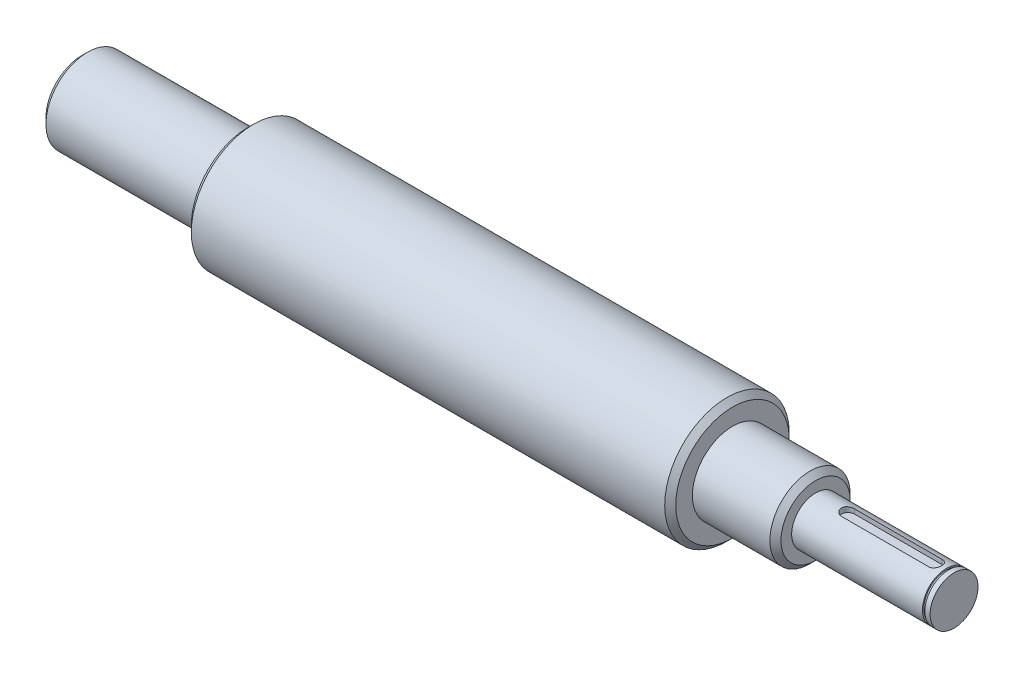
ISO-10303-21;
HEADER;
FILE_DESCRIPTION(('STEP AP214'),'2;1');
FILE_NAME('part.step','',(''),(''),'','','');
FILE_SCHEMA(('AUTOMOTIVE_DESIGN { 1 0 10303 214 1 1 1 1 }'));
ENDSEC;
DATA;
#1=APPLICATION_CONTEXT('core data for automotive mechanical design processes');
#2=APPLICATION_PROTOCOL_DEFINITION('international standard','automotive_design',2000,#1);
#3=PRODUCT_CONTEXT('',#1,'mechanical');
#4=PRODUCT('Part','Part','',(#3));
#5=PRODUCT_RELATED_PRODUCT_CATEGORY('part','',(#4));
#6=PRODUCT_DEFINITION_FORMATION('','',#4);
#7=PRODUCT_DEFINITION_CONTEXT('part definition',#1,'design');
#8=PRODUCT_DEFINITION('design','',#6,#7);
#9=PRODUCT_DEFINITION_SHAPE('','',#8);
#10=(LENGTH_UNIT() NAMED_UNIT(*) SI_UNIT(.MILLI.,.METRE.));
#11=(NAMED_UNIT(*) PLANE_ANGLE_UNIT() SI_UNIT($,.RADIAN.));
#12=(NAMED_UNIT(*) SI_UNIT($,.STERADIAN.) SOLID_ANGLE_UNIT());
#13=UNCERTAINTY_MEASURE_WITH_UNIT(LENGTH_MEASURE(1.E-05),#10,'distance_accuracy_value','');
#14=(GEOMETRIC_REPRESENTATION_CONTEXT(3) GLOBAL_UNCERTAINTY_ASSIGNED_CONTEXT((#13)) GLOBAL_UNIT_ASSIGNED_CONTEXT((#10,
#11,#12)) REPRESENTATION_CONTEXT('',''));
#15=CARTESIAN_POINT('',(0.,0.,0.));
#16=DIRECTION('',(0.,0.,1.));
#17=DIRECTION('',(1.,0.,0.));
#18=AXIS2_PLACEMENT_3D('',#15,#16,#17);
#19=CARTESIAN_POINT('',(-1910.96110575399,0.,0.));
#20=DIRECTION('',(-1.,0.,0.));
#21=DIRECTION('',(0.,0.,1.));
#22=AXIS2_PLACEMENT_3D('',#19,#20,#21);
#23=CYLINDRICAL_SURFACE('',#22,11.);
#24=CARTESIAN_POINT('',(136.5,0.,0.));
#25=DIRECTION('',(-1.,0.,0.));
#26=DIRECTION('',(0.,0.,1.));
#27=AXIS2_PLACEMENT_3D('',#24,#25,#26);
#28=CIRCLE('',#27,11.);
#29=CARTESIAN_POINT('',(136.5,0.,11.));
#30=VERTEX_POINT('',#29);
#31=EDGE_CURVE('E128',#30,#30,#28,.T.);
#32=ORIENTED_EDGE('',*,*,#31,.F.);
#33=EDGE_LOOP('',(#32));
#34=FACE_BOUND('',#33,.T.);
#35=DIRECTION('',(-1.,0.,0.));
#36=VECTOR('',#35,1.);
#37=CARTESIAN_POINT('',(-1910.96110575399,10.5830052442584,-3.));
#38=LINE('',#37,#36);
#39=CARTESIAN_POINT('',(151.375000000001,10.5830052442584,-3.));
#40=VERTEX_POINT('',#39);
#41=CARTESIAN_POINT('',(191.375000000001,10.5830052442584,-3.));
#42=VERTEX_POINT('',#41);
#43=EDGE_CURVE('E12',#40,#42,#38,.F.);
#44=ORIENTED_EDGE('',*,*,#43,.T.);
#45=CARTESIAN_POINT('',(191.375000000001,10.5830052442584,-3.));
#46=CARTESIAN_POINT('',(191.457693891411,10.5829949970026,-3.00000989976809));
#47=CARTESIAN_POINT('',(191.540381704593,10.5839742471726,-2.99658102723594));
#48=CARTESIAN_POINT('',(191.70513356623,10.5878356752194,-2.98292268314841));
#49=CARTESIAN_POINT('',(191.78719773163,10.5907174869552,-2.97269452008914));
#50=CARTESIAN_POINT('',(191.949942512146,10.598299618142,-2.9455445902732));
#51=CARTESIAN_POINT('',(192.030625789387,10.6029958951229,-2.92863770126909));
#52=CARTESIAN_POINT('',(192.190203254055,10.6140571066224,-2.88829120712689));
#53=CARTESIAN_POINT('',(192.269097407409,10.6204220728906,-2.86485147768949));
#54=CARTESIAN_POINT('',(192.502242907165,10.6417494872311,-2.78500332821793));
#55=CARTESIAN_POINT('',(192.653139394856,10.6589535681767,-2.71903526586306));
#56=CARTESIAN_POINT('',(192.941705341769,10.6973836998985,-2.56365897700124));
#57=CARTESIAN_POINT('',(193.079370097105,10.7186111730806,-2.4742424563657));
#58=CARTESIAN_POINT('',(193.341209705979,10.7633148792344,-2.27200424315805));
#59=CARTESIAN_POINT('',(193.464991878244,10.7868322128172,-2.15868225262836));
#60=CARTESIAN_POINT('',(193.692051438906,10.8331129950831,-1.91292298422354));
#61=CARTESIAN_POINT('',(193.795325477294,10.8558763200935,-1.78048258944452));
#62=CARTESIAN_POINT('',(193.980098906747,10.8985459264206,-1.49749198480951));
#63=CARTESIAN_POINT('',(194.061203079822,10.9183977479742,-1.34667477161623));
#64=CARTESIAN_POINT('',(194.19674841378,10.9525311229674,-1.03291980522386));
#65=CARTESIAN_POINT('',(194.251195521133,10.9668139185607,-0.869984764533398));
#66=CARTESIAN_POINT('',(194.330601734903,10.9879090070619,-0.54074467589672));
#67=CARTESIAN_POINT('',(194.35623432637,10.9948916417093,-0.374613167612536));
#68=CARTESIAN_POINT('',(194.379404664848,11.0011960589752,-0.0402673813620229));
#69=CARTESIAN_POINT('',(194.376946716179,11.0005190152883,0.127946573564692));
#70=CARTESIAN_POINT('',(194.344475124185,10.9917041066205,0.456980924404252));
#71=CARTESIAN_POINT('',(194.315189973227,10.9837634920705,0.617879308918083));
#72=CARTESIAN_POINT('',(194.231074784142,10.9615477415639,0.932383527853141));
#73=CARTESIAN_POINT('',(194.176243508316,10.9472722986892,1.08598900853898));
#74=CARTESIAN_POINT('',(194.042045133194,10.9137016176963,1.38338788045077));
#75=CARTESIAN_POINT('',(193.962431753762,10.8943563157114,1.52706425574145));
#76=CARTESIAN_POINT('',(193.781120130094,10.8527253375081,1.79926098198643));
#77=CARTESIAN_POINT('',(193.679417827189,10.830439121215,1.92777854091954));
#78=CARTESIAN_POINT('',(193.452976764917,10.7844948742978,2.1703484411203));
#79=CARTESIAN_POINT('',(193.327605446132,10.760815765188,2.28380693028892));
#80=CARTESIAN_POINT('',(193.059337619131,10.7153886222241,2.48826234185508));
#81=CARTESIAN_POINT('',(192.916436247547,10.6936411271563,2.57925300980783));
#82=CARTESIAN_POINT('',(192.615805187247,10.6544469945807,2.73667910615422));
#83=CARTESIAN_POINT('',(192.457975757244,10.6370325899538,2.80293223890786));
#84=CARTESIAN_POINT('',(192.132912905474,10.6088816209578,2.9076832432578));
#85=CARTESIAN_POINT('',(191.965694057726,10.598135003286,2.94622291362359));
#86=CARTESIAN_POINT('',(191.726645560134,10.588613232355,2.98015870664207));
#87=CARTESIAN_POINT('',(191.656483540277,10.5865140551644,2.98759962141261));
#88=CARTESIAN_POINT('',(191.51589244676,10.58371035186,2.99751512863222));
#89=CARTESIAN_POINT('',(191.445463964942,10.5830036423878,2.99999749605757));
#90=CARTESIAN_POINT('',(191.375000000001,10.5830052442584,3.));
#91=B_SPLINE_CURVE_WITH_KNOTS('',3,(#45,#46,#47,#48,#49,#50,#51,#52,#53,#54,#55,#56,#57,#58,#59,
#60,#61,#62,#63,#64,#65,#66,#67,#68,#69,#70,#71,#72,#73,#74,#75,#76,#77,#78,#79,#80,#81,#82,#83,
#84,#85,#86,#87,#88,#89,#90),.UNSPECIFIED.,.F.,.F.,(4,2,2,2,2,2,2,2,2,2,2,2,2,2,2,2,2,2,2,2,2,2,
4),(0.,0.247994395628699,0.495941079544158,0.743338515979092,0.99074065992621,1.48499724217186,
1.97942888795734,2.4854708385663,2.99159538337129,3.50622794981869,4.02074566333959,
4.52296979924473,5.02511698025349,5.51402000992994,6.00294672920888,6.49689640600088,
6.99093691914145,7.50077286033224,8.01075056671348,8.5244155087371,9.0373040824346,
9.24891043373585,9.46018472611219),.UNSPECIFIED.);
#92=CARTESIAN_POINT('',(191.375000000001,10.5830052442584,3.));
#93=VERTEX_POINT('',#92);
#94=EDGE_CURVE('E176',#42,#93,#91,.T.);
#95=ORIENTED_EDGE('',*,*,#94,.T.);
#96=DIRECTION('',(-1.,0.,0.));
#97=VECTOR('',#96,1.);
#98=CARTESIAN_POINT('',(-1910.96110575399,10.5830052442584,3.));
#99=LINE('',#98,#97);
#100=CARTESIAN_POINT('',(151.375000000001,10.5830052442584,3.));
#101=VERTEX_POINT('',#100);
#102=EDGE_CURVE('E49',#93,#101,#99,.T.);
#103=ORIENTED_EDGE('',*,*,#102,.T.);
#104=CARTESIAN_POINT('',(151.375000000001,10.5830052442584,3.));
#105=CARTESIAN_POINT('',(151.292306108591,10.5829949970026,3.00000989976809));
#106=CARTESIAN_POINT('',(151.209618295409,10.5839742471726,2.99658102723594));
#107=CARTESIAN_POINT('',(151.044866433772,10.5878356752194,2.98292268314841));
#108=CARTESIAN_POINT('',(150.962802268372,10.5907174869552,2.97269452008914));
#109=CARTESIAN_POINT('',(150.800057487856,10.598299618142,2.94554459027321));
#110=CARTESIAN_POINT('',(150.719374210614,10.6029958951229,2.9286377012691));
#111=CARTESIAN_POINT('',(150.559796745946,10.6140571066224,2.88829120712689));
#112=CARTESIAN_POINT('',(150.480902592592,10.6204220728906,2.8648514776895));
#113=CARTESIAN_POINT('',(150.247757092837,10.6417494872311,2.78500332821793));
#114=CARTESIAN_POINT('',(150.096860605145,10.6589535681767,2.71903526586306));
#115=CARTESIAN_POINT('',(149.808294658232,10.6973836998985,2.56365897700124));
#116=CARTESIAN_POINT('',(149.670629902897,10.7186111730806,2.4742424563657));
#117=CARTESIAN_POINT('',(149.408790294022,10.7633148792344,2.27200424315805));
#118=CARTESIAN_POINT('',(149.285008121757,10.7868322128172,2.15868225262836));
#119=CARTESIAN_POINT('',(149.057948561095,10.8331129950831,1.91292298422354));
#120=CARTESIAN_POINT('',(148.954674522707,10.8558763200935,1.78048258944452));
#121=CARTESIAN_POINT('',(148.769901093254,10.8985459264206,1.49749198480951));
#122=CARTESIAN_POINT('',(148.68879692018,10.9183977479742,1.34667477161622));
#123=CARTESIAN_POINT('',(148.553251586221,10.9525311229674,1.03291980522385));
#124=CARTESIAN_POINT('',(148.498804478869,10.9668139185607,0.869984764533394));
#125=CARTESIAN_POINT('',(148.419398265098,10.9879090070619,0.540744675896721));
#126=CARTESIAN_POINT('',(148.393765673631,10.9948916417093,0.374613167612538));
#127=CARTESIAN_POINT('',(148.370595335154,11.0011960589752,0.0402673813620239));
#128=CARTESIAN_POINT('',(148.373053283822,11.0005190152883,-0.127946573564691));
#129=CARTESIAN_POINT('',(148.405524875816,10.9917041066205,-0.456980924404252));
#130=CARTESIAN_POINT('',(148.434810026774,10.9837634920705,-0.617879308918083));
#131=CARTESIAN_POINT('',(148.518925215859,10.9615477415639,-0.932383527853141));
#132=CARTESIAN_POINT('',(148.573756491685,10.9472722986892,-1.08598900853898));
#133=CARTESIAN_POINT('',(148.707954866808,10.9137016176963,-1.38338788045077));
#134=CARTESIAN_POINT('',(148.787568246239,10.8943563157114,-1.52706425574145));
#135=CARTESIAN_POINT('',(148.968879869907,10.8527253375081,-1.79926098198643));
#136=CARTESIAN_POINT('',(149.070582172813,10.830439121215,-1.92777854091954));
#137=CARTESIAN_POINT('',(149.297023235085,10.7844948742978,-2.17034844112029));
#138=CARTESIAN_POINT('',(149.42239455387,10.760815765188,-2.28380693028891));
#139=CARTESIAN_POINT('',(149.690662380871,10.7153886222241,-2.48826234185507));
#140=CARTESIAN_POINT('',(149.833563752455,10.6936411271564,-2.57925300980783));
#141=CARTESIAN_POINT('',(150.134194812755,10.6544469945807,-2.73667910615423));
#142=CARTESIAN_POINT('',(150.292024242758,10.6370325899538,-2.80293223890787));
#143=CARTESIAN_POINT('',(150.617087094528,10.6088816209578,-2.90768324325781));
#144=CARTESIAN_POINT('',(150.784305942276,10.598135003286,-2.9462229136236));
#145=CARTESIAN_POINT('',(151.023354439867,10.588613232355,-2.98015870664207));
#146=CARTESIAN_POINT('',(151.093516459724,10.5865140551644,-2.98759962141261));
#147=CARTESIAN_POINT('',(151.234107553241,10.58371035186,-2.99751512863222));
#148=CARTESIAN_POINT('',(151.304536035059,10.5830036423878,-2.99999749605757));
#149=CARTESIAN_POINT('',(151.375000000001,10.5830052442584,-3.));
#150=B_SPLINE_CURVE_WITH_KNOTS('',3,(#104,#105,#106,#107,#108,#109,#110,#111,#112,#113,#114,
#115,#116,#117,#118,#119,#120,#121,#122,#123,#124,#125,#126,#127,#128,#129,#130,#131,#132,#133,
#134,#135,#136,#137,#138,#139,#140,#141,#142,#143,#144,#145,#146,#147,#148,#149),.UNSPECIFIED.,
.F.,.F.,(4,2,2,2,2,2,2,2,2,2,2,2,2,2,2,2,2,2,2,2,2,2,4),(0.,0.247994395628672,0.49594107954413,
0.743338515979064,0.99074065992621,1.48499724217186,1.97942888795734,2.4854708385663,
2.99159538337129,3.5062279498187,4.02074566333959,4.52296979924472,5.02511698025349,
5.51402000992994,6.00294672920887,6.49689640600088,6.99093691914145,7.50077286033221,
8.01075056671348,8.52441550873715,9.0373040824346,9.24891043373582,9.46018472611219),.UNSPECIFIED.);
#151=EDGE_CURVE('E56',#101,#40,#150,.T.);
#152=ORIENTED_EDGE('',*,*,#151,.T.);
#153=EDGE_LOOP('',(#44,#95,#103,#152));
#154=FACE_BOUND('',#153,.T.);
#155=CARTESIAN_POINT('',(196.49768,0.,0.));
#156=DIRECTION('',(1.,0.,0.));
#157=DIRECTION('',(0.,0.,-1.));
#158=AXIS2_PLACEMENT_3D('',#155,#156,#157);
#159=CIRCLE('',#158,11.);
#160=CARTESIAN_POINT('',(196.49768,0.,-11.));
#161=VERTEX_POINT('',#160);
#162=EDGE_CURVE('E108',#161,#161,#159,.T.);
#163=ORIENTED_EDGE('',*,*,#162,.F.);
#164=EDGE_LOOP('',(#163));
#165=FACE_BOUND('',#164,.T.);
#166=ADVANCED_FACE('F40',(#34,#154,#165),#23,.T.);
#167=CARTESIAN_POINT('',(-200.,0.,0.));
#168=DIRECTION('',(1.,0.,0.));
#169=DIRECTION('',(0.,0.,-1.));
#170=AXIS2_PLACEMENT_3D('',#167,#168,#169);
#171=PLANE('',#170);
#172=CARTESIAN_POINT('',(-200.,0.,0.));
#173=DIRECTION('',(1.,0.,0.));
#174=DIRECTION('',(0.,0.,-1.));
#175=AXIS2_PLACEMENT_3D('',#172,#173,#174);
#176=CIRCLE('',#175,16.51);
#177=CARTESIAN_POINT('',(-200.,0.,-16.51));
#178=VERTEX_POINT('',#177);
#179=EDGE_CURVE('E160',#178,#178,#176,.F.);
#180=ORIENTED_EDGE('',*,*,#179,.T.);
#181=EDGE_LOOP('',(#180));
#182=FACE_BOUND('',#181,.T.);
#183=ADVANCED_FACE('F220',(#182),#171,.F.);
#184=CARTESIAN_POINT('',(-1910.96110575399,0.,0.));
#185=DIRECTION('',(-1.,0.,0.));
#186=DIRECTION('',(0.,0.,1.));
#187=AXIS2_PLACEMENT_3D('',#184,#185,#186);
#188=CYLINDRICAL_SURFACE('',#187,19.05);
#189=CARTESIAN_POINT('',(-126.34,0.,0.));
#190=DIRECTION('',(1.,0.,0.));
#191=DIRECTION('',(0.,0.,-1.));
#192=AXIS2_PLACEMENT_3D('',#189,#190,#191);
#193=CIRCLE('',#192,19.05);
#194=CARTESIAN_POINT('',(-126.34,0.,-19.05));
#195=VERTEX_POINT('',#194);
#196=EDGE_CURVE('E168',#195,#195,#193,.F.);
#197=ORIENTED_EDGE('',*,*,#196,.T.);
#198=EDGE_LOOP('',(#197));
#199=FACE_BOUND('',#198,.T.);
#200=CARTESIAN_POINT('',(-197.46,0.,0.));
#201=DIRECTION('',(1.,0.,0.));
#202=DIRECTION('',(0.,0.,-1.));
#203=AXIS2_PLACEMENT_3D('',#200,#201,#202);
#204=CIRCLE('',#203,19.05);
#205=CARTESIAN_POINT('',(-197.46,0.,-19.05));
#206=VERTEX_POINT('',#205);
#207=EDGE_CURVE('E164',#206,#206,#204,.T.);
#208=ORIENTED_EDGE('',*,*,#207,.T.);
#209=EDGE_LOOP('',(#208));
#210=FACE_BOUND('',#209,.T.);
#211=ADVANCED_FACE('F225',(#199,#210),#188,.T.);
#212=CARTESIAN_POINT('',(-123.8,19.05,0.));
#213=DIRECTION('',(1.,0.,0.));
#214=DIRECTION('',(0.,0.,-1.));
#215=AXIS2_PLACEMENT_3D('',#212,#213,#214);
#216=PLANE('',#215);
#217=CARTESIAN_POINT('',(-123.8,0.,0.));
#218=DIRECTION('',(1.,0.,0.));
#219=DIRECTION('',(0.,0.,-1.));
#220=AXIS2_PLACEMENT_3D('',#217,#218,#219);
#221=CIRCLE('',#220,21.59);
#222=CARTESIAN_POINT('',(-123.8,0.,-21.59));
#223=VERTEX_POINT('',#222);
#224=EDGE_CURVE('E172',#223,#223,#221,.T.);
#225=ORIENTED_EDGE('',*,*,#224,.T.);
#226=EDGE_LOOP('',(#225));
#227=FACE_BOUND('',#226,.T.);
#228=CARTESIAN_POINT('',(-123.8,0.,0.));
#229=DIRECTION('',(1.,0.,0.));
#230=DIRECTION('',(0.,0.,-1.));
#231=AXIS2_PLACEMENT_3D('',#228,#229,#230);
#232=CIRCLE('',#231,26.0349999999998);
#233=CARTESIAN_POINT('',(-123.8,0.,-26.0349999999998));
#234=VERTEX_POINT('',#233);
#235=EDGE_CURVE('E152',#234,#234,#232,.F.);
#236=ORIENTED_EDGE('',*,*,#235,.T.);
#237=EDGE_LOOP('',(#236));
#238=FACE_BOUND('',#237,.T.);
#239=ADVANCED_FACE('F398',(#227,#238),#216,.F.);
#240=CARTESIAN_POINT('',(-1910.96110575399,0.,0.));
#241=DIRECTION('',(-1.,0.,0.));
#242=DIRECTION('',(0.,0.,1.));
#243=AXIS2_PLACEMENT_3D('',#240,#241,#242);
#244=CYLINDRICAL_SURFACE('',#243,28.575);
#245=CARTESIAN_POINT('',(-121.26,0.,0.));
#246=DIRECTION('',(1.,0.,0.));
#247=DIRECTION('',(0.,0.,-1.));
#248=AXIS2_PLACEMENT_3D('',#245,#246,#247);
#249=CIRCLE('',#248,28.575);
#250=CARTESIAN_POINT('',(-121.26,0.,-28.575));
#251=VERTEX_POINT('',#250);
#252=EDGE_CURVE('E156',#251,#251,#249,.T.);
#253=ORIENTED_EDGE('',*,*,#252,.T.);
#254=EDGE_LOOP('',(#253));
#255=FACE_BOUND('',#254,.T.);
#256=CARTESIAN_POINT('',(95.8599999999998,0.,0.));
#257=DIRECTION('',(-1.,0.,0.));
#258=DIRECTION('',(0.,0.,1.));
#259=AXIS2_PLACEMENT_3D('',#256,#257,#258);
#260=CIRCLE('',#259,28.575);
#261=CARTESIAN_POINT('',(95.8599999999998,0.,28.575));
#262=VERTEX_POINT('',#261);
#263=EDGE_CURVE('E144',#262,#262,#260,.T.);
#264=ORIENTED_EDGE('',*,*,#263,.T.);
#265=EDGE_LOOP('',(#264));
#266=FACE_BOUND('',#265,.T.);
#267=ADVANCED_FACE('F391',(#255,#266),#244,.T.);
#268=CARTESIAN_POINT('',(98.4,28.575,0.));
#269=DIRECTION('',(-1.,0.,0.));
#270=DIRECTION('',(0.,0.,1.));
#271=AXIS2_PLACEMENT_3D('',#268,#269,#270);
#272=PLANE('',#271);
#273=CARTESIAN_POINT('',(98.4,0.,0.));
#274=DIRECTION('',(-1.,0.,0.));
#275=DIRECTION('',(0.,0.,1.));
#276=AXIS2_PLACEMENT_3D('',#273,#274,#275);
#277=CIRCLE('',#276,26.035);
#278=CARTESIAN_POINT('',(98.4,0.,26.035));
#279=VERTEX_POINT('',#278);
#280=EDGE_CURVE('E148',#279,#279,#277,.F.);
#281=ORIENTED_EDGE('',*,*,#280,.T.);
#282=EDGE_LOOP('',(#281));
#283=FACE_BOUND('',#282,.T.);
#284=CARTESIAN_POINT('',(98.4,0.,0.));
#285=DIRECTION('',(-1.,0.,0.));
#286=DIRECTION('',(0.,0.,1.));
#287=AXIS2_PLACEMENT_3D('',#284,#285,#286);
#288=CIRCLE('',#287,18.415);
#289=CARTESIAN_POINT('',(98.4,0.,18.415));
#290=VERTEX_POINT('',#289);
#291=EDGE_CURVE('E132',#290,#290,#288,.T.);
#292=ORIENTED_EDGE('',*,*,#291,.T.);
#293=EDGE_LOOP('',(#292));
#294=FACE_BOUND('',#293,.T.);
#295=ADVANCED_FACE('F385',(#283,#294),#272,.F.);
#296=CARTESIAN_POINT('',(-1910.96110575399,0.,0.));
#297=DIRECTION('',(-1.,0.,0.));
#298=DIRECTION('',(0.,0.,1.));
#299=AXIS2_PLACEMENT_3D('',#296,#297,#298);
#300=CYLINDRICAL_SURFACE('',#299,18.415);
#301=CARTESIAN_POINT('',(133.96,0.,0.));
#302=DIRECTION('',(-1.,0.,0.));
#303=DIRECTION('',(0.,0.,1.));
#304=AXIS2_PLACEMENT_3D('',#301,#302,#303);
#305=CIRCLE('',#304,18.415);
#306=CARTESIAN_POINT('',(133.96,0.,18.415));
#307=VERTEX_POINT('',#306);
#308=EDGE_CURVE('E136',#307,#307,#305,.T.);
#309=ORIENTED_EDGE('',*,*,#308,.T.);
#310=EDGE_LOOP('',(#309));
#311=FACE_BOUND('',#310,.T.);
#312=ORIENTED_EDGE('',*,*,#291,.F.);
#313=EDGE_LOOP('',(#312));
#314=FACE_BOUND('',#313,.T.);
#315=ADVANCED_FACE('F379',(#311,#314),#300,.T.);
#316=CARTESIAN_POINT('',(136.5,18.415,0.));
#317=DIRECTION('',(-1.,0.,0.));
#318=DIRECTION('',(0.,0.,1.));
#319=AXIS2_PLACEMENT_3D('',#316,#317,#318);
#320=PLANE('',#319);
#321=CARTESIAN_POINT('',(136.5,0.,0.));
#322=DIRECTION('',(-1.,0.,0.));
#323=DIRECTION('',(0.,0.,1.));
#324=AXIS2_PLACEMENT_3D('',#321,#322,#323);
#325=CIRCLE('',#324,15.8750000000001);
#326=CARTESIAN_POINT('',(136.5,0.,15.8750000000001));
#327=VERTEX_POINT('',#326);
#328=EDGE_CURVE('E140',#327,#327,#325,.F.);
#329=ORIENTED_EDGE('',*,*,#328,.T.);
#330=EDGE_LOOP('',(#329));
#331=FACE_BOUND('',#330,.T.);
#332=ORIENTED_EDGE('',*,*,#31,.T.);
#333=EDGE_LOOP('',(#332));
#334=FACE_BOUND('',#333,.T.);
#335=ADVANCED_FACE('F289',(#331,#334),#320,.F.);
#336=CARTESIAN_POINT('',(133.96,0.,0.));
#337=DIRECTION('',(-1.,0.,0.));
#338=DIRECTION('',(0.,0.,1.));
#339=AXIS2_PLACEMENT_3D('',#336,#337,#338);
#340=CONICAL_SURFACE('',#339,18.415,0.78539816339739);
#341=ORIENTED_EDGE('',*,*,#328,.F.);
#342=EDGE_LOOP('',(#341));
#343=FACE_BOUND('',#342,.T.);
#344=ORIENTED_EDGE('',*,*,#308,.F.);
#345=EDGE_LOOP('',(#344));
#346=FACE_BOUND('',#345,.T.);
#347=ADVANCED_FACE('F299',(#343,#346),#340,.T.);
#348=CARTESIAN_POINT('',(95.8599999999998,0.,0.));
#349=DIRECTION('',(-1.,0.,0.));
#350=DIRECTION('',(0.,0.,1.));
#351=AXIS2_PLACEMENT_3D('',#348,#349,#350);
#352=CONICAL_SURFACE('',#351,28.575,0.785398163397412);
#353=ORIENTED_EDGE('',*,*,#280,.F.);
#354=EDGE_LOOP('',(#353));
#355=FACE_BOUND('',#354,.T.);
#356=ORIENTED_EDGE('',*,*,#263,.F.);
#357=EDGE_LOOP('',(#356));
#358=FACE_BOUND('',#357,.T.);
#359=ADVANCED_FACE('F305',(#355,#358),#352,.T.);
#360=CARTESIAN_POINT('',(-123.8,0.,0.));
#361=DIRECTION('',(1.,0.,0.));
#362=DIRECTION('',(0.,0.,-1.));
#363=AXIS2_PLACEMENT_3D('',#360,#361,#362);
#364=CONICAL_SURFACE('',#363,26.0349999999999,0.785398163397467);
#365=ORIENTED_EDGE('',*,*,#252,.F.);
#366=EDGE_LOOP('',(#365));
#367=FACE_BOUND('',#366,.T.);
#368=ORIENTED_EDGE('',*,*,#235,.F.);
#369=EDGE_LOOP('',(#368));
#370=FACE_BOUND('',#369,.T.);
#371=ADVANCED_FACE('F314',(#367,#370),#364,.T.);
#372=CARTESIAN_POINT('',(-200.,0.,0.));
#373=DIRECTION('',(1.,0.,0.));
#374=DIRECTION('',(0.,0.,-1.));
#375=AXIS2_PLACEMENT_3D('',#372,#373,#374);
#376=CONICAL_SURFACE('',#375,16.51,0.785398163397446);
#377=ORIENTED_EDGE('',*,*,#207,.F.);
#378=EDGE_LOOP('',(#377));
#379=FACE_BOUND('',#378,.T.);
#380=ORIENTED_EDGE('',*,*,#179,.F.);
#381=EDGE_LOOP('',(#380));
#382=FACE_BOUND('',#381,.T.);
#383=ADVANCED_FACE('F324',(#379,#382),#376,.T.);
#384=CARTESIAN_POINT('',(-126.34,0.,0.));
#385=DIRECTION('',(1.,0.,0.));
#386=DIRECTION('',(0.,0.,-1.));
#387=AXIS2_PLACEMENT_3D('',#384,#385,#386);
#388=TOROIDAL_SURFACE('',#387,21.59,2.54);
#389=ORIENTED_EDGE('',*,*,#224,.F.);
#390=EDGE_LOOP('',(#389));
#391=FACE_BOUND('',#390,.T.);
#392=ORIENTED_EDGE('',*,*,#196,.F.);
#393=EDGE_LOOP('',(#392));
#394=FACE_BOUND('',#393,.T.);
#395=ADVANCED_FACE('F42',(#391,#394),#388,.F.);
#396=CARTESIAN_POINT('',(151.375000000001,8.5,0.));
#397=DIRECTION('',(0.,1.,0.));
#398=DIRECTION('',(0.,0.,1.));
#399=AXIS2_PLACEMENT_3D('',#396,#397,#398);
#400=CYLINDRICAL_SURFACE('',#399,3.);
#401=DIRECTION('',(0.,1.,0.));
#402=VECTOR('',#401,1.);
#403=CARTESIAN_POINT('',(151.375000000001,8.5,3.));
#404=LINE('',#403,#402);
#405=CARTESIAN_POINT('',(151.375000000001,8.5,3.));
#406=VERTEX_POINT('',#405);
#407=EDGE_CURVE('E79',#406,#101,#404,.T.);
#408=ORIENTED_EDGE('',*,*,#407,.F.);
#409=CARTESIAN_POINT('',(151.375000000001,8.5,0.));
#410=DIRECTION('',(0.,1.,0.));
#411=DIRECTION('',(0.,0.,1.));
#412=AXIS2_PLACEMENT_3D('',#409,#410,#411);
#413=CIRCLE('',#412,3.);
#414=CARTESIAN_POINT('',(151.375000000001,8.5,-3.));
#415=VERTEX_POINT('',#414);
#416=EDGE_CURVE('E83',#415,#406,#413,.T.);
#417=ORIENTED_EDGE('',*,*,#416,.F.);
#418=DIRECTION('',(0.,1.,0.));
#419=VECTOR('',#418,1.);
#420=CARTESIAN_POINT('',(151.375000000001,8.5,-3.));
#421=LINE('',#420,#419);
#422=EDGE_CURVE('E116',#415,#40,#421,.T.);
#423=ORIENTED_EDGE('',*,*,#422,.T.);
#424=ORIENTED_EDGE('',*,*,#151,.F.);
#425=EDGE_LOOP('',(#408,#417,#423,#424));
#426=FACE_BOUND('',#425,.T.);
#427=ADVANCED_FACE('F81',(#426),#400,.F.);
#428=CARTESIAN_POINT('',(151.375000000001,8.5,-3.));
#429=DIRECTION('',(0.,0.,-1.));
#430=DIRECTION('',(-1.,0.,0.));
#431=AXIS2_PLACEMENT_3D('',#428,#429,#430);
#432=PLANE('',#431);
#433=ORIENTED_EDGE('',*,*,#422,.F.);
#434=DIRECTION('',(-1.,0.,0.));
#435=VECTOR('',#434,1.);
#436=CARTESIAN_POINT('',(151.375000000001,8.5,-3.));
#437=LINE('',#436,#435);
#438=CARTESIAN_POINT('',(191.375000000001,8.5,-3.));
#439=VERTEX_POINT('',#438);
#440=EDGE_CURVE('E89',#439,#415,#437,.T.);
#441=ORIENTED_EDGE('',*,*,#440,.F.);
#442=DIRECTION('',(0.,1.,0.));
#443=VECTOR('',#442,1.);
#444=CARTESIAN_POINT('',(191.375000000001,8.5,-3.));
#445=LINE('',#444,#443);
#446=EDGE_CURVE('E120',#439,#42,#445,.T.);
#447=ORIENTED_EDGE('',*,*,#446,.T.);
#448=ORIENTED_EDGE('',*,*,#43,.F.);
#449=EDGE_LOOP('',(#433,#441,#447,#448));
#450=FACE_BOUND('',#449,.T.);
#451=ADVANCED_FACE('F200',(#450),#432,.F.);
#452=CARTESIAN_POINT('',(191.375000000001,8.5,0.));
#453=DIRECTION('',(0.,1.,0.));
#454=DIRECTION('',(0.,0.,1.));
#455=AXIS2_PLACEMENT_3D('',#452,#453,#454);
#456=CYLINDRICAL_SURFACE('',#455,3.);
#457=ORIENTED_EDGE('',*,*,#446,.F.);
#458=CARTESIAN_POINT('',(191.375000000001,8.5,0.));
#459=DIRECTION('',(0.,1.,0.));
#460=DIRECTION('',(0.,0.,1.));
#461=AXIS2_PLACEMENT_3D('',#458,#459,#460);
#462=CIRCLE('',#461,3.);
#463=CARTESIAN_POINT('',(191.375000000001,8.5,3.));
#464=VERTEX_POINT('',#463);
#465=EDGE_CURVE('E99',#464,#439,#462,.T.);
#466=ORIENTED_EDGE('',*,*,#465,.F.);
#467=DIRECTION('',(0.,1.,0.));
#468=VECTOR('',#467,1.);
#469=CARTESIAN_POINT('',(191.375000000001,8.5,3.));
#470=LINE('',#469,#468);
#471=EDGE_CURVE('E88',#464,#93,#470,.T.);
#472=ORIENTED_EDGE('',*,*,#471,.T.);
#473=ORIENTED_EDGE('',*,*,#94,.F.);
#474=EDGE_LOOP('',(#457,#466,#472,#473));
#475=FACE_BOUND('',#474,.T.);
#476=ADVANCED_FACE('F195',(#475),#456,.F.);
#477=CARTESIAN_POINT('',(151.375000000001,8.5,3.));
#478=DIRECTION('',(0.,0.,1.));
#479=DIRECTION('',(1.,0.,0.));
#480=AXIS2_PLACEMENT_3D('',#477,#478,#479);
#481=PLANE('',#480);
#482=ORIENTED_EDGE('',*,*,#471,.F.);
#483=DIRECTION('',(1.,0.,0.));
#484=VECTOR('',#483,1.);
#485=CARTESIAN_POINT('',(151.375000000001,8.5,3.));
#486=LINE('',#485,#484);
#487=EDGE_CURVE('E92',#406,#464,#486,.T.);
#488=ORIENTED_EDGE('',*,*,#487,.F.);
#489=ORIENTED_EDGE('',*,*,#407,.T.);
#490=ORIENTED_EDGE('',*,*,#102,.F.);
#491=EDGE_LOOP('',(#482,#488,#489,#490));
#492=FACE_BOUND('',#491,.T.);
#493=ADVANCED_FACE('F93',(#492),#481,.F.);
#494=CARTESIAN_POINT('',(151.375000000001,8.5,0.));
#495=DIRECTION('',(0.,1.,0.));
#496=DIRECTION('',(0.,0.,1.));
#497=AXIS2_PLACEMENT_3D('',#494,#495,#496);
#498=PLANE('',#497);
#499=ORIENTED_EDGE('',*,*,#416,.T.);
#500=ORIENTED_EDGE('',*,*,#487,.T.);
#501=ORIENTED_EDGE('',*,*,#465,.T.);
#502=ORIENTED_EDGE('',*,*,#440,.T.);
#503=EDGE_LOOP('',(#499,#500,#501,#502));
#504=FACE_BOUND('',#503,.T.);
#505=ADVANCED_FACE('F101',(#504),#498,.T.);
#506=CARTESIAN_POINT('',(197.59768,0.,0.));
#507=DIRECTION('',(1.,0.,0.));
#508=DIRECTION('',(0.,0.,-1.));
#509=AXIS2_PLACEMENT_3D('',#506,#507,#508);
#510=PLANE('',#509);
#511=CARTESIAN_POINT('',(197.59768,0.,0.));
#512=DIRECTION('',(1.,0.,0.));
#513=DIRECTION('',(0.,0.,-1.));
#514=AXIS2_PLACEMENT_3D('',#511,#512,#513);
#515=CIRCLE('',#514,11.);
#516=CARTESIAN_POINT('',(197.59768,0.,-11.));
#517=VERTEX_POINT('',#516);
#518=EDGE_CURVE('E104',#517,#517,#515,.T.);
#519=ORIENTED_EDGE('',*,*,#518,.F.);
#520=EDGE_LOOP('',(#519));
#521=FACE_BOUND('',#520,.T.);
#522=CARTESIAN_POINT('',(197.59768,0.,0.));
#523=DIRECTION('',(1.,0.,0.));
#524=DIRECTION('',(0.,0.,-1.));
#525=AXIS2_PLACEMENT_3D('',#522,#523,#524);
#526=CIRCLE('',#525,10.35);
#527=CARTESIAN_POINT('',(197.59768,0.,-10.35));
#528=VERTEX_POINT('',#527);
#529=EDGE_CURVE('E235',#528,#528,#526,.T.);
#530=ORIENTED_EDGE('',*,*,#529,.T.);
#531=EDGE_LOOP('',(#530));
#532=FACE_BOUND('',#531,.T.);
#533=ADVANCED_FACE('F249',(#521,#532),#510,.F.);
#534=CARTESIAN_POINT('',(196.49768,0.,0.));
#535=DIRECTION('',(1.,0.,0.));
#536=DIRECTION('',(0.,0.,-1.));
#537=AXIS2_PLACEMENT_3D('',#534,#535,#536);
#538=PLANE('',#537);
#539=ORIENTED_EDGE('',*,*,#162,.T.);
#540=EDGE_LOOP('',(#539));
#541=FACE_BOUND('',#540,.T.);
#542=CARTESIAN_POINT('',(196.49768,0.,0.));
#543=DIRECTION('',(1.,0.,0.));
#544=DIRECTION('',(0.,0.,-1.));
#545=AXIS2_PLACEMENT_3D('',#542,#543,#544);
#546=CIRCLE('',#545,10.35);
#547=CARTESIAN_POINT('',(196.49768,0.,-10.35));
#548=VERTEX_POINT('',#547);
#549=EDGE_CURVE('E238',#548,#548,#546,.T.);
#550=ORIENTED_EDGE('',*,*,#549,.F.);
#551=EDGE_LOOP('',(#550));
#552=FACE_BOUND('',#551,.T.);
#553=ADVANCED_FACE('F215',(#541,#552),#538,.T.);
#554=CARTESIAN_POINT('',(197.59768,0.,0.));
#555=DIRECTION('',(-1.,0.,0.));
#556=DIRECTION('',(0.,0.,1.));
#557=AXIS2_PLACEMENT_3D('',#554,#555,#556);
#558=CYLINDRICAL_SURFACE('',#557,10.35);
#559=ORIENTED_EDGE('',*,*,#529,.F.);
#560=EDGE_LOOP('',(#559));
#561=FACE_BOUND('',#560,.T.);
#562=ORIENTED_EDGE('',*,*,#549,.T.);
#563=EDGE_LOOP('',(#562));
#564=FACE_BOUND('',#563,.T.);
#565=ADVANCED_FACE('F208',(#561,#564),#558,.T.);
#566=CARTESIAN_POINT('',(200.,11.,0.));
#567=DIRECTION('',(-1.,0.,0.));
#568=DIRECTION('',(0.,0.,1.));
#569=AXIS2_PLACEMENT_3D('',#566,#567,#568);
#570=PLANE('',#569);
#571=CARTESIAN_POINT('',(200.,0.,0.));
#572=DIRECTION('',(-1.,0.,0.));
#573=DIRECTION('',(0.,0.,1.));
#574=AXIS2_PLACEMENT_3D('',#571,#572,#573);
#575=CIRCLE('',#574,11.);
#576=CARTESIAN_POINT('',(200.,0.,11.));
#577=VERTEX_POINT('',#576);
#578=EDGE_CURVE('E119',#577,#577,#575,.T.);
#579=ORIENTED_EDGE('',*,*,#578,.F.);
#580=EDGE_LOOP('',(#579));
#581=FACE_BOUND('',#580,.T.);
#582=ADVANCED_FACE('F206',(#581),#570,.F.);
#583=ORIENTED_EDGE('',*,*,#518,.T.);
#584=EDGE_LOOP('',(#583));
#585=FACE_BOUND('',#584,.T.);
#586=ORIENTED_EDGE('',*,*,#578,.T.);
#587=EDGE_LOOP('',(#586));
#588=FACE_BOUND('',#587,.T.);
#589=ADVANCED_FACE('F191',(#585,#588),#23,.T.);
#590=CLOSED_SHELL('',(#166,#183,#211,#239,#267,#295,#315,#335,#347,#359,#371,#383,#395,#427,
#451,#476,#493,#505,#533,#553,#565,#582,#589));
#591=MANIFOLD_SOLID_BREP('B2',#590);
#592=ADVANCED_BREP_SHAPE_REPRESENTATION('',(#18,#591),#14);
#593=SHAPE_DEFINITION_REPRESENTATION(#9,#592);
ENDSEC;
END-ISO-10303-21;
